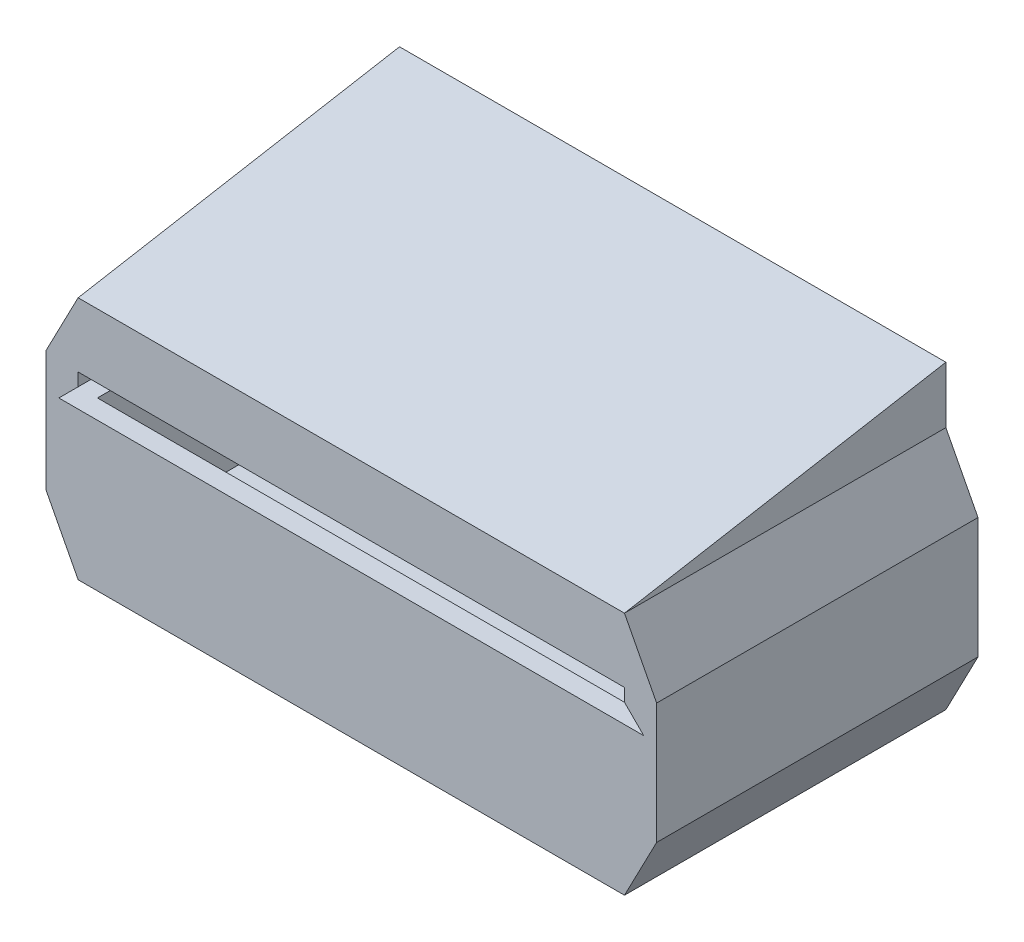
ISO-10303-21;
HEADER;
FILE_DESCRIPTION(('STEP AP214'),'2;1');
FILE_NAME('part.step','',(''),(''),'','','');
FILE_SCHEMA(('AUTOMOTIVE_DESIGN { 1 0 10303 214 1 1 1 1 }'));
ENDSEC;
DATA;
#1=APPLICATION_CONTEXT('core data for automotive mechanical design processes');
#2=APPLICATION_PROTOCOL_DEFINITION('international standard','automotive_design',2000,#1);
#3=PRODUCT_CONTEXT('',#1,'mechanical');
#4=PRODUCT('Part','Part','',(#3));
#5=PRODUCT_RELATED_PRODUCT_CATEGORY('part','',(#4));
#6=PRODUCT_DEFINITION_FORMATION('','',#4);
#7=PRODUCT_DEFINITION_CONTEXT('part definition',#1,'design');
#8=PRODUCT_DEFINITION('design','',#6,#7);
#9=PRODUCT_DEFINITION_SHAPE('','',#8);
#10=(LENGTH_UNIT() NAMED_UNIT(*) SI_UNIT(.MILLI.,.METRE.));
#11=(NAMED_UNIT(*) PLANE_ANGLE_UNIT() SI_UNIT($,.RADIAN.));
#12=(NAMED_UNIT(*) SI_UNIT($,.STERADIAN.) SOLID_ANGLE_UNIT());
#13=UNCERTAINTY_MEASURE_WITH_UNIT(LENGTH_MEASURE(1.E-05),#10,'distance_accuracy_value','');
#14=(GEOMETRIC_REPRESENTATION_CONTEXT(3) GLOBAL_UNCERTAINTY_ASSIGNED_CONTEXT((#13)) GLOBAL_UNIT_ASSIGNED_CONTEXT((#10,
#11,#12)) REPRESENTATION_CONTEXT('',''));
#15=CARTESIAN_POINT('',(0.,0.,0.));
#16=DIRECTION('',(0.,0.,1.));
#17=DIRECTION('',(1.,0.,0.));
#18=AXIS2_PLACEMENT_3D('',#15,#16,#17);
#19=CARTESIAN_POINT('',(85.,38.,-3.00000000000004));
#20=DIRECTION('',(0.,0.,1.));
#21=DIRECTION('',(1.,0.,0.));
#22=AXIS2_PLACEMENT_3D('',#19,#20,#21);
#23=PLANE('',#22);
#24=DIRECTION('',(0.,-1.,0.));
#25=VECTOR('',#24,1.);
#26=CARTESIAN_POINT('',(3.,38.,-3.00000000000006));
#27=LINE('',#26,#25);
#28=CARTESIAN_POINT('',(3.,35.482701106467,-3.00000000000006));
#29=VERTEX_POINT('',#28);
#30=CARTESIAN_POINT('',(3.,31.,-3.00000000000006));
#31=VERTEX_POINT('',#30);
#32=EDGE_CURVE('E342',#29,#31,#27,.T.);
#33=ORIENTED_EDGE('',*,*,#32,.F.);
#34=DIRECTION('',(1.,0.,0.));
#35=VECTOR('',#34,1.);
#36=CARTESIAN_POINT('',(85.,35.482701106467,-3.00000000000004));
#37=LINE('',#36,#35);
#38=CARTESIAN_POINT('',(82.,35.482701106467,-3.00000000000008));
#39=VERTEX_POINT('',#38);
#40=EDGE_CURVE('E335',#29,#39,#37,.T.);
#41=ORIENTED_EDGE('',*,*,#40,.T.);
#42=DIRECTION('',(0.,-1.,0.));
#43=VECTOR('',#42,1.);
#44=CARTESIAN_POINT('',(82.,38.,-3.00000000000008));
#45=LINE('',#44,#43);
#46=CARTESIAN_POINT('',(82.,31.,-3.00000000000008));
#47=VERTEX_POINT('',#46);
#48=EDGE_CURVE('E339',#39,#47,#45,.T.);
#49=ORIENTED_EDGE('',*,*,#48,.T.);
#50=DIRECTION('',(-0.707106781186548,0.707106781186547,0.));
#51=VECTOR('',#50,1.);
#52=CARTESIAN_POINT('',(80.,33.,-3.00000000000004));
#53=LINE('',#52,#51);
#54=CARTESIAN_POINT('',(85.,28.,-3.00000000000004));
#55=VERTEX_POINT('',#54);
#56=EDGE_CURVE('E235',#47,#55,#53,.F.);
#57=ORIENTED_EDGE('',*,*,#56,.T.);
#58=DIRECTION('',(-1.,0.,0.));
#59=VECTOR('',#58,1.);
#60=CARTESIAN_POINT('',(85.,28.,-3.00000000000004));
#61=LINE('',#60,#59);
#62=CARTESIAN_POINT('',(0.,28.,-3.00000000000003));
#63=VERTEX_POINT('',#62);
#64=EDGE_CURVE('E224',#55,#63,#61,.T.);
#65=ORIENTED_EDGE('',*,*,#64,.T.);
#66=DIRECTION('',(-0.707106781186549,-0.707106781186546,0.));
#67=VECTOR('',#66,1.);
#68=CARTESIAN_POINT('',(47.5000000000002,75.5,-3.00000000000004));
#69=LINE('',#68,#67);
#70=EDGE_CURVE('E232',#63,#31,#69,.F.);
#71=ORIENTED_EDGE('',*,*,#70,.T.);
#72=EDGE_LOOP('',(#33,#41,#49,#57,#65,#71));
#73=FACE_BOUND('',#72,.T.);
#74=ADVANCED_FACE('F33',(#73),#23,.F.);
#75=CARTESIAN_POINT('',(85.,38.,-90.));
#76=DIRECTION('',(-1.,0.,0.));
#77=DIRECTION('',(0.,0.,1.));
#78=AXIS2_PLACEMENT_3D('',#75,#76,#77);
#79=PLANE('',#78);
#80=DIRECTION('',(0.,1.,0.));
#81=VECTOR('',#80,1.);
#82=CARTESIAN_POINT('',(85.,38.,-50.));
#83=LINE('',#82,#81);
#84=CARTESIAN_POINT('',(85.,26.,-50.));
#85=VERTEX_POINT('',#84);
#86=CARTESIAN_POINT('',(85.,28.,-50.));
#87=VERTEX_POINT('',#86);
#88=EDGE_CURVE('E304',#85,#87,#83,.T.);
#89=ORIENTED_EDGE('',*,*,#88,.F.);
#90=DIRECTION('',(0.,0.,1.));
#91=VECTOR('',#90,1.);
#92=CARTESIAN_POINT('',(85.,26.,-90.));
#93=LINE('',#92,#91);
#94=CARTESIAN_POINT('',(85.,26.,0.));
#95=VERTEX_POINT('',#94);
#96=EDGE_CURVE('E375',#85,#95,#93,.T.);
#97=ORIENTED_EDGE('',*,*,#96,.T.);
#98=DIRECTION('',(0.,1.,0.));
#99=VECTOR('',#98,1.);
#100=CARTESIAN_POINT('',(85.,26.,0.));
#101=LINE('',#100,#99);
#102=CARTESIAN_POINT('',(85.,28.,0.));
#103=VERTEX_POINT('',#102);
#104=EDGE_CURVE('E347',#95,#103,#101,.T.);
#105=ORIENTED_EDGE('',*,*,#104,.T.);
#106=DIRECTION('',(0.,0.,1.));
#107=VECTOR('',#106,1.);
#108=CARTESIAN_POINT('',(85.,28.,-10.));
#109=LINE('',#108,#107);
#110=EDGE_CURVE('E353',#55,#103,#109,.T.);
#111=ORIENTED_EDGE('',*,*,#110,.F.);
#112=EDGE_CURVE('E358',#87,#55,#109,.T.);
#113=ORIENTED_EDGE('',*,*,#112,.F.);
#114=EDGE_LOOP('',(#89,#97,#105,#111,#113));
#115=FACE_BOUND('',#114,.T.);
#116=ADVANCED_FACE('F419',(#115),#79,.T.);
#117=CARTESIAN_POINT('',(0.,38.,-90.));
#118=DIRECTION('',(1.,0.,0.));
#119=DIRECTION('',(0.,1.,0.));
#120=AXIS2_PLACEMENT_3D('',#117,#118,#119);
#121=PLANE('',#120);
#122=DIRECTION('',(0.,-1.,0.));
#123=VECTOR('',#122,1.);
#124=CARTESIAN_POINT('',(0.,38.,-50.));
#125=LINE('',#124,#123);
#126=CARTESIAN_POINT('',(0.,28.,-50.));
#127=VERTEX_POINT('',#126);
#128=CARTESIAN_POINT('',(0.,26.,-50.));
#129=VERTEX_POINT('',#128);
#130=EDGE_CURVE('E302',#127,#129,#125,.T.);
#131=ORIENTED_EDGE('',*,*,#130,.F.);
#132=DIRECTION('',(0.,0.,1.));
#133=VECTOR('',#132,1.);
#134=CARTESIAN_POINT('',(0.,28.,-10.));
#135=LINE('',#134,#133);
#136=EDGE_CURVE('E354',#127,#63,#135,.T.);
#137=ORIENTED_EDGE('',*,*,#136,.T.);
#138=CARTESIAN_POINT('',(0.,28.,0.));
#139=VERTEX_POINT('',#138);
#140=EDGE_CURVE('E357',#63,#139,#135,.T.);
#141=ORIENTED_EDGE('',*,*,#140,.T.);
#142=DIRECTION('',(0.,-1.,0.));
#143=VECTOR('',#142,1.);
#144=CARTESIAN_POINT('',(0.,26.,0.));
#145=LINE('',#144,#143);
#146=CARTESIAN_POINT('',(0.,26.,0.));
#147=VERTEX_POINT('',#146);
#148=EDGE_CURVE('E344',#139,#147,#145,.T.);
#149=ORIENTED_EDGE('',*,*,#148,.T.);
#150=DIRECTION('',(0.,0.,1.));
#151=VECTOR('',#150,1.);
#152=CARTESIAN_POINT('',(0.,26.,-90.));
#153=LINE('',#152,#151);
#154=EDGE_CURVE('E381',#129,#147,#153,.T.);
#155=ORIENTED_EDGE('',*,*,#154,.F.);
#156=EDGE_LOOP('',(#131,#137,#141,#149,#155));
#157=FACE_BOUND('',#156,.T.);
#158=ADVANCED_FACE('F425',(#157),#121,.T.);
#159=DIRECTION('',(0.,-1.,0.));
#160=VECTOR('',#159,1.);
#161=CARTESIAN_POINT('',(0.,38.,-50.));
#162=LINE('',#161,#160);
#163=CARTESIAN_POINT('',(0.,23.,-50.));
#164=VERTEX_POINT('',#163);
#165=CARTESIAN_POINT('',(0.,3.,-50.));
#166=VERTEX_POINT('',#165);
#167=EDGE_CURVE('E316',#164,#166,#162,.T.);
#168=ORIENTED_EDGE('',*,*,#167,.F.);
#169=DIRECTION('',(0.,0.,1.));
#170=VECTOR('',#169,1.);
#171=CARTESIAN_POINT('',(0.,23.,-90.));
#172=LINE('',#171,#170);
#173=CARTESIAN_POINT('',(0.,23.,-3.00000000000003));
#174=VERTEX_POINT('',#173);
#175=EDGE_CURVE('E378',#164,#174,#172,.T.);
#176=ORIENTED_EDGE('',*,*,#175,.T.);
#177=DIRECTION('',(0.,-1.,0.));
#178=VECTOR('',#177,1.);
#179=CARTESIAN_POINT('',(0.,23.,-3.));
#180=LINE('',#179,#178);
#181=CARTESIAN_POINT('',(0.,3.,-3.));
#182=VERTEX_POINT('',#181);
#183=EDGE_CURVE('E356',#174,#182,#180,.T.);
#184=ORIENTED_EDGE('',*,*,#183,.T.);
#185=DIRECTION('',(0.,0.,1.));
#186=VECTOR('',#185,1.);
#187=CARTESIAN_POINT('',(0.,3.,0.));
#188=LINE('',#187,#186);
#189=EDGE_CURVE('E216',#166,#182,#188,.T.);
#190=ORIENTED_EDGE('',*,*,#189,.F.);
#191=EDGE_LOOP('',(#168,#176,#184,#190));
#192=FACE_BOUND('',#191,.T.);
#193=ADVANCED_FACE('F465',(#192),#121,.T.);
#194=CARTESIAN_POINT('',(0.,3.,0.));
#195=DIRECTION('',(0.,-1.,0.));
#196=DIRECTION('',(0.,0.,-1.));
#197=AXIS2_PLACEMENT_3D('',#194,#195,#196);
#198=PLANE('',#197);
#199=DIRECTION('',(0.,0.,-1.));
#200=VECTOR('',#199,1.);
#201=CARTESIAN_POINT('',(85.,3.,0.));
#202=LINE('',#201,#200);
#203=CARTESIAN_POINT('',(85.,3.,-3.));
#204=VERTEX_POINT('',#203);
#205=CARTESIAN_POINT('',(85.,3.,-50.));
#206=VERTEX_POINT('',#205);
#207=EDGE_CURVE('E219',#204,#206,#202,.T.);
#208=ORIENTED_EDGE('',*,*,#207,.T.);
#209=DIRECTION('',(-1.,0.,0.));
#210=VECTOR('',#209,1.);
#211=CARTESIAN_POINT('',(0.,3.,-50.));
#212=LINE('',#211,#210);
#213=EDGE_CURVE('E320',#206,#166,#212,.T.);
#214=ORIENTED_EDGE('',*,*,#213,.T.);
#215=ORIENTED_EDGE('',*,*,#189,.T.);
#216=DIRECTION('',(1.,0.,0.));
#217=VECTOR('',#216,1.);
#218=CARTESIAN_POINT('',(0.,3.,-3.));
#219=LINE('',#218,#217);
#220=EDGE_CURVE('E362',#182,#204,#219,.T.);
#221=ORIENTED_EDGE('',*,*,#220,.T.);
#222=EDGE_LOOP('',(#208,#214,#215,#221));
#223=FACE_BOUND('',#222,.T.);
#224=ADVANCED_FACE('F451',(#223),#198,.F.);
#225=DIRECTION('',(0.,1.,0.));
#226=VECTOR('',#225,1.);
#227=CARTESIAN_POINT('',(85.,38.,-50.));
#228=LINE('',#227,#226);
#229=CARTESIAN_POINT('',(85.,23.,-50.));
#230=VERTEX_POINT('',#229);
#231=EDGE_CURVE('E318',#206,#230,#228,.T.);
#232=ORIENTED_EDGE('',*,*,#231,.F.);
#233=ORIENTED_EDGE('',*,*,#207,.F.);
#234=DIRECTION('',(0.,1.,0.));
#235=VECTOR('',#234,1.);
#236=CARTESIAN_POINT('',(85.,23.,-3.));
#237=LINE('',#236,#235);
#238=CARTESIAN_POINT('',(85.,23.,-3.00000000000003));
#239=VERTEX_POINT('',#238);
#240=EDGE_CURVE('E364',#204,#239,#237,.T.);
#241=ORIENTED_EDGE('',*,*,#240,.T.);
#242=DIRECTION('',(0.,0.,1.));
#243=VECTOR('',#242,1.);
#244=CARTESIAN_POINT('',(85.,23.,-90.));
#245=LINE('',#244,#243);
#246=EDGE_CURVE('E386',#230,#239,#245,.T.);
#247=ORIENTED_EDGE('',*,*,#246,.F.);
#248=EDGE_LOOP('',(#232,#233,#241,#247));
#249=FACE_BOUND('',#248,.T.);
#250=ADVANCED_FACE('F428',(#249),#79,.T.);
#251=CARTESIAN_POINT('',(0.,3.,0.));
#252=DIRECTION('',(0.,0.,-1.));
#253=DIRECTION('',(-1.,0.,0.));
#254=AXIS2_PLACEMENT_3D('',#251,#252,#253);
#255=PLANE('',#254);
#256=DIRECTION('',(-0.707106781186548,-0.707106781186547,0.));
#257=VECTOR('',#256,1.);
#258=CARTESIAN_POINT('',(-3.,23.,0.));
#259=LINE('',#258,#257);
#260=CARTESIAN_POINT('',(-3.,23.,0.));
#261=VERTEX_POINT('',#260);
#262=EDGE_CURVE('E374',#147,#261,#259,.T.);
#263=ORIENTED_EDGE('',*,*,#262,.F.);
#264=ORIENTED_EDGE('',*,*,#148,.F.);
#265=DIRECTION('',(-1.,0.,0.));
#266=VECTOR('',#265,1.);
#267=CARTESIAN_POINT('',(0.,28.,0.));
#268=LINE('',#267,#266);
#269=EDGE_CURVE('E350',#103,#139,#268,.T.);
#270=ORIENTED_EDGE('',*,*,#269,.F.);
#271=ORIENTED_EDGE('',*,*,#104,.F.);
#272=DIRECTION('',(-0.707106781186548,0.707106781186547,0.));
#273=VECTOR('',#272,1.);
#274=CARTESIAN_POINT('',(88.,23.,0.));
#275=LINE('',#274,#273);
#276=CARTESIAN_POINT('',(88.,23.,0.));
#277=VERTEX_POINT('',#276);
#278=EDGE_CURVE('E370',#277,#95,#275,.T.);
#279=ORIENTED_EDGE('',*,*,#278,.F.);
#280=DIRECTION('',(1.,0.,0.));
#281=VECTOR('',#280,1.);
#282=CARTESIAN_POINT('',(0.,23.,0.));
#283=LINE('',#282,#281);
#284=EDGE_CURVE('E371',#261,#277,#283,.T.);
#285=ORIENTED_EDGE('',*,*,#284,.F.);
#286=EDGE_LOOP('',(#263,#264,#270,#271,#279,#285));
#287=FACE_BOUND('',#286,.T.);
#288=DIRECTION('',(-0.461591586339288,0.887092558542106,0.));
#289=VECTOR('',#288,1.);
#290=CARTESIAN_POINT('',(90.,28.3909366548759,0.));
#291=LINE('',#290,#289);
#292=CARTESIAN_POINT('',(90.,28.3909366548759,0.));
#293=VERTEX_POINT('',#292);
#294=CARTESIAN_POINT('',(85.,38.,0.));
#295=VERTEX_POINT('',#294);
#296=EDGE_CURVE('E263',#293,#295,#291,.T.);
#297=ORIENTED_EDGE('',*,*,#296,.T.);
#298=DIRECTION('',(-1.,0.,0.));
#299=VECTOR('',#298,1.);
#300=CARTESIAN_POINT('',(0.,37.9999999999988,0.));
#301=LINE('',#300,#299);
#302=CARTESIAN_POINT('',(0.,38.,0.));
#303=VERTEX_POINT('',#302);
#304=EDGE_CURVE('E241',#295,#303,#301,.T.);
#305=ORIENTED_EDGE('',*,*,#304,.T.);
#306=DIRECTION('',(-0.461591586339287,-0.887092558542106,0.));
#307=VECTOR('',#306,1.);
#308=CARTESIAN_POINT('',(-5.,28.3909366548759,0.));
#309=LINE('',#308,#307);
#310=CARTESIAN_POINT('',(-5.,28.3909366548759,0.));
#311=VERTEX_POINT('',#310);
#312=EDGE_CURVE('E259',#303,#311,#309,.T.);
#313=ORIENTED_EDGE('',*,*,#312,.T.);
#314=DIRECTION('',(0.,-1.,0.));
#315=VECTOR('',#314,1.);
#316=CARTESIAN_POINT('',(-5.,9.60906334512409,0.));
#317=LINE('',#316,#315);
#318=CARTESIAN_POINT('',(-5.,9.60906334512409,0.));
#319=VERTEX_POINT('',#318);
#320=EDGE_CURVE('E269',#311,#319,#317,.T.);
#321=ORIENTED_EDGE('',*,*,#320,.T.);
#322=DIRECTION('',(0.461591586339287,-0.887092558542106,0.));
#323=VECTOR('',#322,1.);
#324=CARTESIAN_POINT('',(0.,0.,0.));
#325=LINE('',#324,#323);
#326=CARTESIAN_POINT('',(0.,0.,0.));
#327=VERTEX_POINT('',#326);
#328=EDGE_CURVE('E270',#319,#327,#325,.T.);
#329=ORIENTED_EDGE('',*,*,#328,.T.);
#330=DIRECTION('',(1.,0.,0.));
#331=VECTOR('',#330,1.);
#332=CARTESIAN_POINT('',(0.,0.,0.));
#333=LINE('',#332,#331);
#334=CARTESIAN_POINT('',(85.,0.,0.));
#335=VERTEX_POINT('',#334);
#336=EDGE_CURVE('E217',#327,#335,#333,.T.);
#337=ORIENTED_EDGE('',*,*,#336,.T.);
#338=DIRECTION('',(0.461591586339288,0.887092558542106,0.));
#339=VECTOR('',#338,1.);
#340=CARTESIAN_POINT('',(85.,0.,0.));
#341=LINE('',#340,#339);
#342=CARTESIAN_POINT('',(90.,9.60906334512409,0.));
#343=VERTEX_POINT('',#342);
#344=EDGE_CURVE('E214',#335,#343,#341,.T.);
#345=ORIENTED_EDGE('',*,*,#344,.T.);
#346=DIRECTION('',(0.,1.,0.));
#347=VECTOR('',#346,1.);
#348=CARTESIAN_POINT('',(90.,9.60906334512409,0.));
#349=LINE('',#348,#347);
#350=EDGE_CURVE('E392',#343,#293,#349,.T.);
#351=ORIENTED_EDGE('',*,*,#350,.T.);
#352=EDGE_LOOP('',(#297,#305,#313,#321,#329,#337,#345,#351));
#353=FACE_BOUND('',#352,.T.);
#354=ADVANCED_FACE('F257',(#287,#353),#255,.F.);
#355=CARTESIAN_POINT('',(0.,0.,0.));
#356=DIRECTION('',(0.,-1.,0.));
#357=DIRECTION('',(0.,0.,-1.));
#358=AXIS2_PLACEMENT_3D('',#355,#356,#357);
#359=PLANE('',#358);
#360=DIRECTION('',(-1.,0.,0.));
#361=VECTOR('',#360,1.);
#362=CARTESIAN_POINT('',(-5.,0.,-50.));
#363=LINE('',#362,#361);
#364=CARTESIAN_POINT('',(85.,0.,-50.));
#365=VERTEX_POINT('',#364);
#366=CARTESIAN_POINT('',(0.,0.,-50.));
#367=VERTEX_POINT('',#366);
#368=EDGE_CURVE('E194',#365,#367,#363,.T.);
#369=ORIENTED_EDGE('',*,*,#368,.F.);
#370=DIRECTION('',(0.,0.,-1.));
#371=VECTOR('',#370,1.);
#372=CARTESIAN_POINT('',(85.,0.,0.));
#373=LINE('',#372,#371);
#374=EDGE_CURVE('E209',#335,#365,#373,.T.);
#375=ORIENTED_EDGE('',*,*,#374,.F.);
#376=ORIENTED_EDGE('',*,*,#336,.F.);
#377=DIRECTION('',(0.,0.,1.));
#378=VECTOR('',#377,1.);
#379=CARTESIAN_POINT('',(0.,0.,0.));
#380=LINE('',#379,#378);
#381=EDGE_CURVE('E210',#367,#327,#380,.T.);
#382=ORIENTED_EDGE('',*,*,#381,.F.);
#383=EDGE_LOOP('',(#369,#375,#376,#382));
#384=FACE_BOUND('',#383,.T.);
#385=ADVANCED_FACE('F207',(#384),#359,.T.);
#386=CARTESIAN_POINT('',(0.,0.,-90.));
#387=DIRECTION('',(-0.887092558542106,-0.461591586339287,0.));
#388=DIRECTION('',(0.461591586339287,-0.887092558542106,0.));
#389=AXIS2_PLACEMENT_3D('',#386,#387,#388);
#390=PLANE('',#389);
#391=DIRECTION('',(-0.461591586339287,0.887092558542106,0.));
#392=VECTOR('',#391,1.);
#393=CARTESIAN_POINT('',(0.,0.,-50.));
#394=LINE('',#393,#392);
#395=CARTESIAN_POINT('',(-5.,9.60906334512409,-50.));
#396=VERTEX_POINT('',#395);
#397=EDGE_CURVE('E201',#367,#396,#394,.T.);
#398=ORIENTED_EDGE('',*,*,#397,.F.);
#399=ORIENTED_EDGE('',*,*,#381,.T.);
#400=ORIENTED_EDGE('',*,*,#328,.F.);
#401=DIRECTION('',(0.,0.,1.));
#402=VECTOR('',#401,1.);
#403=CARTESIAN_POINT('',(-5.,9.60906334512409,-90.));
#404=LINE('',#403,#402);
#405=EDGE_CURVE('E278',#396,#319,#404,.T.);
#406=ORIENTED_EDGE('',*,*,#405,.F.);
#407=EDGE_LOOP('',(#398,#399,#400,#406));
#408=FACE_BOUND('',#407,.T.);
#409=ADVANCED_FACE('F285',(#408),#390,.T.);
#410=CARTESIAN_POINT('',(-5.,9.60906334512409,-90.));
#411=DIRECTION('',(-1.,0.,0.));
#412=DIRECTION('',(0.,-1.,0.));
#413=AXIS2_PLACEMENT_3D('',#410,#411,#412);
#414=PLANE('',#413);
#415=DIRECTION('',(0.,-1.,0.));
#416=VECTOR('',#415,1.);
#417=CARTESIAN_POINT('',(-5.,53.8694282637604,-50.));
#418=LINE('',#417,#416);
#419=CARTESIAN_POINT('',(-5.,28.3909366548759,-50.));
#420=VERTEX_POINT('',#419);
#421=EDGE_CURVE('E290',#420,#396,#418,.T.);
#422=ORIENTED_EDGE('',*,*,#421,.T.);
#423=ORIENTED_EDGE('',*,*,#405,.T.);
#424=ORIENTED_EDGE('',*,*,#320,.F.);
#425=DIRECTION('',(0.,0.,1.));
#426=VECTOR('',#425,1.);
#427=CARTESIAN_POINT('',(-5.,28.3909366548759,-90.));
#428=LINE('',#427,#426);
#429=EDGE_CURVE('E268',#420,#311,#428,.T.);
#430=ORIENTED_EDGE('',*,*,#429,.F.);
#431=EDGE_LOOP('',(#422,#423,#424,#430));
#432=FACE_BOUND('',#431,.T.);
#433=ADVANCED_FACE('F289',(#432),#414,.T.);
#434=CARTESIAN_POINT('',(-5.,28.3909366548759,-90.));
#435=DIRECTION('',(-0.887092558542106,0.461591586339287,0.));
#436=DIRECTION('',(-0.461591586339287,-0.887092558542106,0.));
#437=AXIS2_PLACEMENT_3D('',#434,#435,#436);
#438=PLANE('',#437);
#439=DIRECTION('',(0.461591586339287,0.887092558542106,0.));
#440=VECTOR('',#439,1.);
#441=CARTESIAN_POINT('',(-5.,28.3909366548759,-50.));
#442=LINE('',#441,#440);
#443=CARTESIAN_POINT('',(0.,38.,-50.));
#444=VERTEX_POINT('',#443);
#445=EDGE_CURVE('E202',#420,#444,#442,.T.);
#446=ORIENTED_EDGE('',*,*,#445,.F.);
#447=ORIENTED_EDGE('',*,*,#429,.T.);
#448=ORIENTED_EDGE('',*,*,#312,.F.);
#449=DIRECTION('',(0.,0.,1.));
#450=VECTOR('',#449,1.);
#451=CARTESIAN_POINT('',(0.,38.,-90.));
#452=LINE('',#451,#450);
#453=EDGE_CURVE('E248',#444,#303,#452,.T.);
#454=ORIENTED_EDGE('',*,*,#453,.F.);
#455=EDGE_LOOP('',(#446,#447,#448,#454));
#456=FACE_BOUND('',#455,.T.);
#457=ADVANCED_FACE('F266',(#456),#438,.T.);
#458=CARTESIAN_POINT('',(85.,0.,-90.));
#459=DIRECTION('',(0.887092558542106,-0.461591586339288,0.));
#460=DIRECTION('',(0.461591586339288,0.887092558542106,0.));
#461=AXIS2_PLACEMENT_3D('',#458,#459,#460);
#462=PLANE('',#461);
#463=DIRECTION('',(-0.461591586339288,-0.887092558542106,0.));
#464=VECTOR('',#463,1.);
#465=CARTESIAN_POINT('',(85.,0.,-50.));
#466=LINE('',#465,#464);
#467=CARTESIAN_POINT('',(90.,9.60906334512409,-50.));
#468=VERTEX_POINT('',#467);
#469=EDGE_CURVE('E191',#468,#365,#466,.T.);
#470=ORIENTED_EDGE('',*,*,#469,.F.);
#471=DIRECTION('',(0.,0.,1.));
#472=VECTOR('',#471,1.);
#473=CARTESIAN_POINT('',(90.,9.60906334512409,-90.));
#474=LINE('',#473,#472);
#475=EDGE_CURVE('E395',#468,#343,#474,.T.);
#476=ORIENTED_EDGE('',*,*,#475,.T.);
#477=ORIENTED_EDGE('',*,*,#344,.F.);
#478=ORIENTED_EDGE('',*,*,#374,.T.);
#479=EDGE_LOOP('',(#470,#476,#477,#478));
#480=FACE_BOUND('',#479,.T.);
#481=ADVANCED_FACE('F212',(#480),#462,.T.);
#482=CARTESIAN_POINT('',(90.,28.3909366548759,-90.));
#483=DIRECTION('',(0.887092558542106,0.461591586339288,0.));
#484=DIRECTION('',(-0.461591586339288,0.887092558542106,0.));
#485=AXIS2_PLACEMENT_3D('',#482,#483,#484);
#486=PLANE('',#485);
#487=DIRECTION('',(0.461591586339288,-0.887092558542106,0.));
#488=VECTOR('',#487,1.);
#489=CARTESIAN_POINT('',(90.,28.3909366548759,-50.));
#490=LINE('',#489,#488);
#491=CARTESIAN_POINT('',(85.,38.,-50.));
#492=VERTEX_POINT('',#491);
#493=CARTESIAN_POINT('',(90.,28.3909366548759,-50.));
#494=VERTEX_POINT('',#493);
#495=EDGE_CURVE('E328',#492,#494,#490,.T.);
#496=ORIENTED_EDGE('',*,*,#495,.F.);
#497=DIRECTION('',(0.,0.,1.));
#498=VECTOR('',#497,1.);
#499=CARTESIAN_POINT('',(85.,38.,-90.));
#500=LINE('',#499,#498);
#501=EDGE_CURVE('E274',#492,#295,#500,.T.);
#502=ORIENTED_EDGE('',*,*,#501,.T.);
#503=ORIENTED_EDGE('',*,*,#296,.F.);
#504=DIRECTION('',(0.,0.,1.));
#505=VECTOR('',#504,1.);
#506=CARTESIAN_POINT('',(90.,28.3909366548759,-90.));
#507=LINE('',#506,#505);
#508=EDGE_CURVE('E397',#494,#293,#507,.T.);
#509=ORIENTED_EDGE('',*,*,#508,.F.);
#510=EDGE_LOOP('',(#496,#502,#503,#509));
#511=FACE_BOUND('',#510,.T.);
#512=ADVANCED_FACE('F404',(#511),#486,.T.);
#513=CARTESIAN_POINT('',(90.,9.60906334512409,-90.));
#514=DIRECTION('',(1.,0.,0.));
#515=DIRECTION('',(0.,0.,-1.));
#516=AXIS2_PLACEMENT_3D('',#513,#514,#515);
#517=PLANE('',#516);
#518=DIRECTION('',(0.,-1.,0.));
#519=VECTOR('',#518,1.);
#520=CARTESIAN_POINT('',(90.,53.8694282637604,-50.));
#521=LINE('',#520,#519);
#522=EDGE_CURVE('E197',#494,#468,#521,.T.);
#523=ORIENTED_EDGE('',*,*,#522,.F.);
#524=ORIENTED_EDGE('',*,*,#508,.T.);
#525=ORIENTED_EDGE('',*,*,#350,.F.);
#526=ORIENTED_EDGE('',*,*,#475,.F.);
#527=EDGE_LOOP('',(#523,#524,#525,#526));
#528=FACE_BOUND('',#527,.T.);
#529=ADVANCED_FACE('F400',(#528),#517,.T.);
#530=CARTESIAN_POINT('',(88.,23.,-90.));
#531=DIRECTION('',(0.707106781186547,0.707106781186548,0.));
#532=DIRECTION('',(-0.707106781186548,0.707106781186547,0.));
#533=AXIS2_PLACEMENT_3D('',#530,#531,#532);
#534=PLANE('',#533);
#535=ORIENTED_EDGE('',*,*,#96,.F.);
#536=DIRECTION('',(0.707106781186548,-0.707106781186547,0.));
#537=VECTOR('',#536,1.);
#538=CARTESIAN_POINT('',(88.,23.,-50.));
#539=LINE('',#538,#537);
#540=CARTESIAN_POINT('',(88.,23.,-50.));
#541=VERTEX_POINT('',#540);
#542=EDGE_CURVE('E312',#85,#541,#539,.T.);
#543=ORIENTED_EDGE('',*,*,#542,.T.);
#544=DIRECTION('',(0.,0.,1.));
#545=VECTOR('',#544,1.);
#546=CARTESIAN_POINT('',(88.,23.,-90.));
#547=LINE('',#546,#545);
#548=EDGE_CURVE('E388',#541,#277,#547,.T.);
#549=ORIENTED_EDGE('',*,*,#548,.T.);
#550=ORIENTED_EDGE('',*,*,#278,.T.);
#551=EDGE_LOOP('',(#535,#543,#549,#550));
#552=FACE_BOUND('',#551,.T.);
#553=ADVANCED_FACE('F445',(#552),#534,.F.);
#554=CARTESIAN_POINT('',(0.,23.,-90.));
#555=DIRECTION('',(0.,-1.,0.));
#556=DIRECTION('',(0.,0.,-1.));
#557=AXIS2_PLACEMENT_3D('',#554,#555,#556);
#558=PLANE('',#557);
#559=ORIENTED_EDGE('',*,*,#548,.F.);
#560=DIRECTION('',(-1.,0.,0.));
#561=VECTOR('',#560,1.);
#562=CARTESIAN_POINT('',(0.,23.,-50.));
#563=LINE('',#562,#561);
#564=EDGE_CURVE('E313',#541,#230,#563,.T.);
#565=ORIENTED_EDGE('',*,*,#564,.T.);
#566=ORIENTED_EDGE('',*,*,#246,.T.);
#567=DIRECTION('',(-1.,0.,0.));
#568=VECTOR('',#567,1.);
#569=CARTESIAN_POINT('',(0.,23.,-3.));
#570=LINE('',#569,#568);
#571=EDGE_CURVE('E367',#239,#174,#570,.T.);
#572=ORIENTED_EDGE('',*,*,#571,.T.);
#573=ORIENTED_EDGE('',*,*,#175,.F.);
#574=CARTESIAN_POINT('',(-3.,23.,-50.));
#575=VERTEX_POINT('',#574);
#576=EDGE_CURVE('E309',#164,#575,#563,.T.);
#577=ORIENTED_EDGE('',*,*,#576,.T.);
#578=DIRECTION('',(0.,0.,1.));
#579=VECTOR('',#578,1.);
#580=CARTESIAN_POINT('',(-3.,23.,-90.));
#581=LINE('',#580,#579);
#582=EDGE_CURVE('E379',#575,#261,#581,.T.);
#583=ORIENTED_EDGE('',*,*,#582,.T.);
#584=ORIENTED_EDGE('',*,*,#284,.T.);
#585=EDGE_LOOP('',(#559,#565,#566,#572,#573,#577,#583,#584));
#586=FACE_BOUND('',#585,.T.);
#587=ADVANCED_FACE('F441',(#586),#558,.F.);
#588=CARTESIAN_POINT('',(-3.,23.,-90.));
#589=DIRECTION('',(-0.707106781186547,0.707106781186548,0.));
#590=DIRECTION('',(-0.707106781186548,-0.707106781186547,0.));
#591=AXIS2_PLACEMENT_3D('',#588,#589,#590);
#592=PLANE('',#591);
#593=ORIENTED_EDGE('',*,*,#582,.F.);
#594=DIRECTION('',(0.707106781186548,0.707106781186547,0.));
#595=VECTOR('',#594,1.);
#596=CARTESIAN_POINT('',(-3.,23.,-50.));
#597=LINE('',#596,#595);
#598=EDGE_CURVE('E306',#575,#129,#597,.T.);
#599=ORIENTED_EDGE('',*,*,#598,.T.);
#600=ORIENTED_EDGE('',*,*,#154,.T.);
#601=ORIENTED_EDGE('',*,*,#262,.T.);
#602=EDGE_LOOP('',(#593,#599,#600,#601));
#603=FACE_BOUND('',#602,.T.);
#604=ADVANCED_FACE('F437',(#603),#592,.F.);
#605=CARTESIAN_POINT('',(0.,0.,-3.));
#606=DIRECTION('',(0.,0.,1.));
#607=DIRECTION('',(1.,0.,0.));
#608=AXIS2_PLACEMENT_3D('',#605,#606,#607);
#609=PLANE('',#608);
#610=ORIENTED_EDGE('',*,*,#183,.F.);
#611=ORIENTED_EDGE('',*,*,#571,.F.);
#612=ORIENTED_EDGE('',*,*,#240,.F.);
#613=ORIENTED_EDGE('',*,*,#220,.F.);
#614=EDGE_LOOP('',(#610,#611,#612,#613));
#615=FACE_BOUND('',#614,.T.);
#616=ADVANCED_FACE('F434',(#615),#609,.F.);
#617=CARTESIAN_POINT('',(0.,28.,-10.));
#618=DIRECTION('',(0.,1.,0.));
#619=DIRECTION('',(0.,0.,1.));
#620=AXIS2_PLACEMENT_3D('',#617,#618,#619);
#621=PLANE('',#620);
#622=ORIENTED_EDGE('',*,*,#140,.F.);
#623=ORIENTED_EDGE('',*,*,#64,.F.);
#624=ORIENTED_EDGE('',*,*,#110,.T.);
#625=ORIENTED_EDGE('',*,*,#269,.T.);
#626=EDGE_LOOP('',(#622,#623,#624,#625));
#627=FACE_BOUND('',#626,.T.);
#628=ADVANCED_FACE('F432',(#627),#621,.F.);
#629=CARTESIAN_POINT('',(3.,38.,-3.00000000000006));
#630=DIRECTION('',(-1.,0.,0.));
#631=DIRECTION('',(0.,0.,1.));
#632=AXIS2_PLACEMENT_3D('',#629,#630,#631);
#633=PLANE('',#632);
#634=DIRECTION('',(0.,0.,-1.));
#635=VECTOR('',#634,1.);
#636=CARTESIAN_POINT('',(3.,31.,-3.00000000000006));
#637=LINE('',#636,#635);
#638=CARTESIAN_POINT('',(3.,31.,-50.));
#639=VERTEX_POINT('',#638);
#640=EDGE_CURVE('E227',#31,#639,#637,.T.);
#641=ORIENTED_EDGE('',*,*,#640,.T.);
#642=DIRECTION('',(0.,1.,0.));
#643=VECTOR('',#642,1.);
#644=CARTESIAN_POINT('',(3.,38.,-50.));
#645=LINE('',#644,#643);
#646=CARTESIAN_POINT('',(3.,43.7700691997647,-50.));
#647=VERTEX_POINT('',#646);
#648=EDGE_CURVE('E292',#639,#647,#645,.T.);
#649=ORIENTED_EDGE('',*,*,#648,.T.);
#650=DIRECTION('',(0.,-0.173648177666927,0.984807753012209));
#651=VECTOR('',#650,1.);
#652=CARTESIAN_POINT('',(3.,35.5586069559507,-3.43048346417991));
#653=LINE('',#652,#651);
#654=EDGE_CURVE('E337',#647,#29,#653,.T.);
#655=ORIENTED_EDGE('',*,*,#654,.T.);
#656=ORIENTED_EDGE('',*,*,#32,.T.);
#657=EDGE_LOOP('',(#641,#649,#655,#656));
#658=FACE_BOUND('',#657,.T.);
#659=ADVANCED_FACE('F507',(#658),#633,.F.);
#660=CARTESIAN_POINT('',(82.,38.,-3.00000000000008));
#661=DIRECTION('',(1.,0.,0.));
#662=DIRECTION('',(0.,0.,-1.));
#663=AXIS2_PLACEMENT_3D('',#660,#661,#662);
#664=PLANE('',#663);
#665=DIRECTION('',(0.,0.173648177666927,-0.984807753012209));
#666=VECTOR('',#665,1.);
#667=CARTESIAN_POINT('',(82.,35.5586069559507,-3.43048346417993));
#668=LINE('',#667,#666);
#669=CARTESIAN_POINT('',(82.,43.7700691997647,-50.));
#670=VERTEX_POINT('',#669);
#671=EDGE_CURVE('E332',#39,#670,#668,.T.);
#672=ORIENTED_EDGE('',*,*,#671,.T.);
#673=DIRECTION('',(0.,-1.,0.));
#674=VECTOR('',#673,1.);
#675=CARTESIAN_POINT('',(82.,38.,-50.));
#676=LINE('',#675,#674);
#677=CARTESIAN_POINT('',(82.,31.,-50.));
#678=VERTEX_POINT('',#677);
#679=EDGE_CURVE('E55',#670,#678,#676,.T.);
#680=ORIENTED_EDGE('',*,*,#679,.T.);
#681=DIRECTION('',(0.,0.,1.));
#682=VECTOR('',#681,1.);
#683=CARTESIAN_POINT('',(82.,31.,-3.00000000000008));
#684=LINE('',#683,#682);
#685=EDGE_CURVE('E230',#678,#47,#684,.T.);
#686=ORIENTED_EDGE('',*,*,#685,.T.);
#687=ORIENTED_EDGE('',*,*,#48,.F.);
#688=EDGE_LOOP('',(#672,#680,#686,#687));
#689=FACE_BOUND('',#688,.T.);
#690=ADVANCED_FACE('F479',(#689),#664,.F.);
#691=CARTESIAN_POINT('',(3.,31.,-3.00000000000006));
#692=DIRECTION('',(-0.707106781186546,0.707106781186549,0.));
#693=DIRECTION('',(0.,0.,-1.));
#694=AXIS2_PLACEMENT_3D('',#691,#692,#693);
#695=PLANE('',#694);
#696=DIRECTION('',(0.707106781186549,0.707106781186546,0.));
#697=VECTOR('',#696,1.);
#698=CARTESIAN_POINT('',(3.,31.,-50.));
#699=LINE('',#698,#697);
#700=EDGE_CURVE('E300',#639,#127,#699,.F.);
#701=ORIENTED_EDGE('',*,*,#700,.F.);
#702=ORIENTED_EDGE('',*,*,#640,.F.);
#703=ORIENTED_EDGE('',*,*,#70,.F.);
#704=ORIENTED_EDGE('',*,*,#136,.F.);
#705=EDGE_LOOP('',(#701,#702,#703,#704));
#706=FACE_BOUND('',#705,.T.);
#707=ADVANCED_FACE('F477',(#706),#695,.F.);
#708=CARTESIAN_POINT('',(82.,31.,-3.00000000000008));
#709=DIRECTION('',(0.707106781186547,0.707106781186548,0.));
#710=DIRECTION('',(0.,0.,1.));
#711=AXIS2_PLACEMENT_3D('',#708,#709,#710);
#712=PLANE('',#711);
#713=DIRECTION('',(0.707106781186548,-0.707106781186547,0.));
#714=VECTOR('',#713,1.);
#715=CARTESIAN_POINT('',(82.,31.,-50.));
#716=LINE('',#715,#714);
#717=EDGE_CURVE('E298',#87,#678,#716,.F.);
#718=ORIENTED_EDGE('',*,*,#717,.F.);
#719=ORIENTED_EDGE('',*,*,#112,.T.);
#720=ORIENTED_EDGE('',*,*,#56,.F.);
#721=ORIENTED_EDGE('',*,*,#685,.F.);
#722=EDGE_LOOP('',(#718,#719,#720,#721));
#723=FACE_BOUND('',#722,.T.);
#724=ADVANCED_FACE('F415',(#723),#712,.F.);
#725=CARTESIAN_POINT('',(0.,68.,0.));
#726=DIRECTION('',(1.,0.,0.));
#727=DIRECTION('',(0.,0.,-1.));
#728=AXIS2_PLACEMENT_3D('',#725,#726,#727);
#729=PLANE('',#728);
#730=DIRECTION('',(0.,-0.173648177666927,0.984807753012209));
#731=VECTOR('',#730,1.);
#732=CARTESIAN_POINT('',(0.,68.,-170.138454588541));
#733=LINE('',#732,#731);
#734=CARTESIAN_POINT('',(0.,46.8163490354219,-50.));
#735=VERTEX_POINT('',#734);
#736=EDGE_CURVE('E41',#303,#735,#733,.F.);
#737=ORIENTED_EDGE('',*,*,#736,.T.);
#738=DIRECTION('',(0.,-1.,0.));
#739=VECTOR('',#738,1.);
#740=CARTESIAN_POINT('',(0.,68.,-50.));
#741=LINE('',#740,#739);
#742=EDGE_CURVE('E48',#735,#444,#741,.T.);
#743=ORIENTED_EDGE('',*,*,#742,.T.);
#744=ORIENTED_EDGE('',*,*,#453,.T.);
#745=EDGE_LOOP('',(#737,#743,#744));
#746=FACE_BOUND('',#745,.T.);
#747=ADVANCED_FACE('F246',(#746),#729,.F.);
#748=CARTESIAN_POINT('',(85.,68.,-90.));
#749=DIRECTION('',(-1.,0.,0.));
#750=DIRECTION('',(0.,0.,1.));
#751=AXIS2_PLACEMENT_3D('',#748,#749,#750);
#752=PLANE('',#751);
#753=ORIENTED_EDGE('',*,*,#501,.F.);
#754=DIRECTION('',(0.,1.,0.));
#755=VECTOR('',#754,1.);
#756=CARTESIAN_POINT('',(85.,68.,-50.));
#757=LINE('',#756,#755);
#758=CARTESIAN_POINT('',(85.,46.8163490354219,-50.));
#759=VERTEX_POINT('',#758);
#760=EDGE_CURVE('E324',#492,#759,#757,.T.);
#761=ORIENTED_EDGE('',*,*,#760,.T.);
#762=DIRECTION('',(0.,0.173648177666927,-0.984807753012209));
#763=VECTOR('',#762,1.);
#764=CARTESIAN_POINT('',(85.,68.,-170.138454588541));
#765=LINE('',#764,#763);
#766=EDGE_CURVE('E238',#759,#295,#765,.F.);
#767=ORIENTED_EDGE('',*,*,#766,.T.);
#768=EDGE_LOOP('',(#753,#761,#767));
#769=FACE_BOUND('',#768,.T.);
#770=ADVANCED_FACE('F407',(#769),#752,.F.);
#771=CARTESIAN_POINT('',(0.,68.,-170.138454588541));
#772=DIRECTION('',(0.,-0.984807753012208,-0.173648177666927));
#773=DIRECTION('',(1.,0.,0.));
#774=AXIS2_PLACEMENT_3D('',#771,#772,#773);
#775=PLANE('',#774);
#776=DIRECTION('',(-1.,0.,0.));
#777=VECTOR('',#776,1.);
#778=CARTESIAN_POINT('',(0.,46.8163490354219,-50.));
#779=LINE('',#778,#777);
#780=EDGE_CURVE('E252',#735,#759,#779,.F.);
#781=ORIENTED_EDGE('',*,*,#780,.F.);
#782=ORIENTED_EDGE('',*,*,#736,.F.);
#783=ORIENTED_EDGE('',*,*,#304,.F.);
#784=ORIENTED_EDGE('',*,*,#766,.F.);
#785=EDGE_LOOP('',(#781,#782,#783,#784));
#786=FACE_BOUND('',#785,.T.);
#787=ADVANCED_FACE('F35',(#786),#775,.F.);
#788=CARTESIAN_POINT('',(0.,33.8997365358945,5.97743819018661));
#789=DIRECTION('',(0.,-0.984807753012209,-0.173648177666927));
#790=DIRECTION('',(0.,0.173648177666927,-0.984807753012209));
#791=AXIS2_PLACEMENT_3D('',#788,#789,#790);
#792=PLANE('',#791);
#793=DIRECTION('',(-1.,0.,0.));
#794=VECTOR('',#793,1.);
#795=CARTESIAN_POINT('',(0.,43.7700691997647,-50.));
#796=LINE('',#795,#794);
#797=EDGE_CURVE('E11',#670,#647,#796,.T.);
#798=ORIENTED_EDGE('',*,*,#797,.F.);
#799=ORIENTED_EDGE('',*,*,#671,.F.);
#800=ORIENTED_EDGE('',*,*,#40,.F.);
#801=ORIENTED_EDGE('',*,*,#654,.F.);
#802=EDGE_LOOP('',(#798,#799,#800,#801));
#803=FACE_BOUND('',#802,.T.);
#804=ADVANCED_FACE('F414',(#803),#792,.T.);
#805=CARTESIAN_POINT('',(-5.,53.8694282637604,-50.));
#806=DIRECTION('',(0.,0.,1.));
#807=DIRECTION('',(1.,0.,0.));
#808=AXIS2_PLACEMENT_3D('',#805,#806,#807);
#809=PLANE('',#808);
#810=ORIENTED_EDGE('',*,*,#397,.T.);
#811=ORIENTED_EDGE('',*,*,#421,.F.);
#812=ORIENTED_EDGE('',*,*,#445,.T.);
#813=ORIENTED_EDGE('',*,*,#742,.F.);
#814=ORIENTED_EDGE('',*,*,#780,.T.);
#815=ORIENTED_EDGE('',*,*,#760,.F.);
#816=ORIENTED_EDGE('',*,*,#495,.T.);
#817=ORIENTED_EDGE('',*,*,#522,.T.);
#818=ORIENTED_EDGE('',*,*,#469,.T.);
#819=ORIENTED_EDGE('',*,*,#368,.T.);
#820=EDGE_LOOP('',(#810,#811,#812,#813,#814,#815,#816,#817,#818,#819));
#821=FACE_BOUND('',#820,.T.);
#822=ORIENTED_EDGE('',*,*,#231,.T.);
#823=ORIENTED_EDGE('',*,*,#564,.F.);
#824=ORIENTED_EDGE('',*,*,#542,.F.);
#825=ORIENTED_EDGE('',*,*,#88,.T.);
#826=ORIENTED_EDGE('',*,*,#717,.T.);
#827=ORIENTED_EDGE('',*,*,#679,.F.);
#828=ORIENTED_EDGE('',*,*,#797,.T.);
#829=ORIENTED_EDGE('',*,*,#648,.F.);
#830=ORIENTED_EDGE('',*,*,#700,.T.);
#831=ORIENTED_EDGE('',*,*,#130,.T.);
#832=ORIENTED_EDGE('',*,*,#598,.F.);
#833=ORIENTED_EDGE('',*,*,#576,.F.);
#834=ORIENTED_EDGE('',*,*,#167,.T.);
#835=ORIENTED_EDGE('',*,*,#213,.F.);
#836=EDGE_LOOP('',(#822,#823,#824,#825,#826,#827,#828,#829,#830,#831,#832,#833,#834,#835));
#837=FACE_BOUND('',#836,.T.);
#838=ADVANCED_FACE('F193',(#821,#837),#809,.F.);
#839=CLOSED_SHELL('',(#74,#116,#158,#193,#224,#250,#354,#385,#409,#433,#457,#481,#512,#529,#553,
#587,#604,#616,#628,#659,#690,#707,#724,#747,#770,#787,#804,#838));
#840=MANIFOLD_SOLID_BREP('B2',#839);
#841=ADVANCED_BREP_SHAPE_REPRESENTATION('',(#18,#840),#14);
#842=SHAPE_DEFINITION_REPRESENTATION(#9,#841);
ENDSEC;
END-ISO-10303-21;
